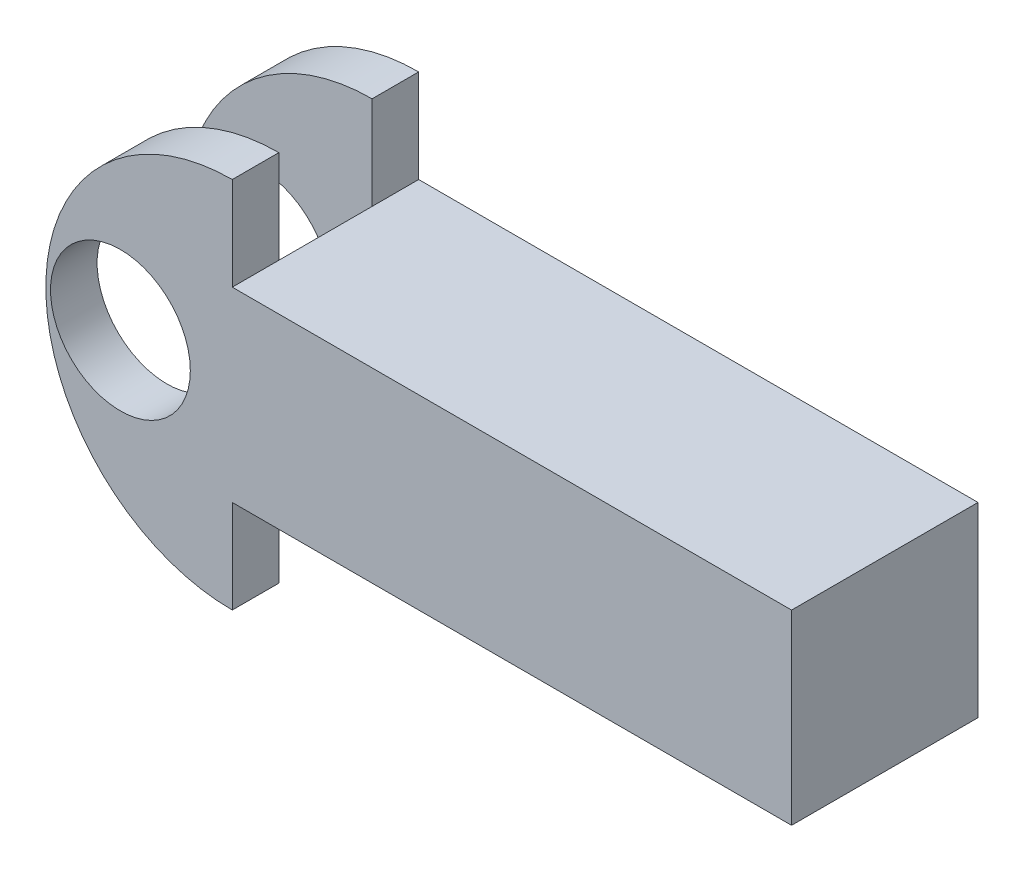
ISO-10303-21;
HEADER;
FILE_DESCRIPTION(('STEP AP214'),'2;1');
FILE_NAME('part.step','',(''),(''),'','','');
FILE_SCHEMA(('AUTOMOTIVE_DESIGN { 1 0 10303 214 1 1 1 1 }'));
ENDSEC;
DATA;
#1=APPLICATION_CONTEXT('core data for automotive mechanical design processes');
#2=APPLICATION_PROTOCOL_DEFINITION('international standard','automotive_design',2000,#1);
#3=PRODUCT_CONTEXT('',#1,'mechanical');
#4=PRODUCT('Part','Part','',(#3));
#5=PRODUCT_RELATED_PRODUCT_CATEGORY('part','',(#4));
#6=PRODUCT_DEFINITION_FORMATION('','',#4);
#7=PRODUCT_DEFINITION_CONTEXT('part definition',#1,'design');
#8=PRODUCT_DEFINITION('design','',#6,#7);
#9=PRODUCT_DEFINITION_SHAPE('','',#8);
#10=(LENGTH_UNIT() NAMED_UNIT(*) SI_UNIT(.MILLI.,.METRE.));
#11=(NAMED_UNIT(*) PLANE_ANGLE_UNIT() SI_UNIT($,.RADIAN.));
#12=(NAMED_UNIT(*) SI_UNIT($,.STERADIAN.) SOLID_ANGLE_UNIT());
#13=UNCERTAINTY_MEASURE_WITH_UNIT(LENGTH_MEASURE(1.E-05),#10,'distance_accuracy_value','');
#14=(GEOMETRIC_REPRESENTATION_CONTEXT(3) GLOBAL_UNCERTAINTY_ASSIGNED_CONTEXT((#13)) GLOBAL_UNIT_ASSIGNED_CONTEXT((#10,
#11,#12)) REPRESENTATION_CONTEXT('',''));
#15=CARTESIAN_POINT('',(0.,0.,0.));
#16=DIRECTION('',(0.,0.,1.));
#17=DIRECTION('',(1.,0.,0.));
#18=AXIS2_PLACEMENT_3D('',#15,#16,#17);
#19=CARTESIAN_POINT('',(30.,-10.,10.));
#20=DIRECTION('',(-1.,0.,0.));
#21=DIRECTION('',(0.,0.,1.));
#22=AXIS2_PLACEMENT_3D('',#19,#20,#21);
#23=PLANE('',#22);
#24=DIRECTION('',(0.,1.,0.));
#25=VECTOR('',#24,1.);
#26=CARTESIAN_POINT('',(30.,-10.,-10.));
#27=LINE('',#26,#25);
#28=CARTESIAN_POINT('',(30.,-10.,-10.));
#29=VERTEX_POINT('',#28);
#30=CARTESIAN_POINT('',(30.,10.,-10.));
#31=VERTEX_POINT('',#30);
#32=EDGE_CURVE('E187',#29,#31,#27,.T.);
#33=ORIENTED_EDGE('',*,*,#32,.T.);
#34=DIRECTION('',(0.,0.,-1.));
#35=VECTOR('',#34,1.);
#36=CARTESIAN_POINT('',(30.,10.,10.));
#37=LINE('',#36,#35);
#38=CARTESIAN_POINT('',(30.,10.,10.));
#39=VERTEX_POINT('',#38);
#40=EDGE_CURVE('E11',#39,#31,#37,.T.);
#41=ORIENTED_EDGE('',*,*,#40,.F.);
#42=DIRECTION('',(0.,1.,0.));
#43=VECTOR('',#42,1.);
#44=CARTESIAN_POINT('',(30.,-10.,10.));
#45=LINE('',#44,#43);
#46=CARTESIAN_POINT('',(30.,-10.,10.));
#47=VERTEX_POINT('',#46);
#48=EDGE_CURVE('E188',#47,#39,#45,.T.);
#49=ORIENTED_EDGE('',*,*,#48,.F.);
#50=DIRECTION('',(0.,0.,-1.));
#51=VECTOR('',#50,1.);
#52=CARTESIAN_POINT('',(30.,-10.,10.));
#53=LINE('',#52,#51);
#54=EDGE_CURVE('E194',#47,#29,#53,.T.);
#55=ORIENTED_EDGE('',*,*,#54,.T.);
#56=EDGE_LOOP('',(#33,#41,#49,#55));
#57=FACE_BOUND('',#56,.T.);
#58=ADVANCED_FACE('F40',(#57),#23,.F.);
#59=CARTESIAN_POINT('',(-30.,10.,10.));
#60=DIRECTION('',(0.,-1.,0.));
#61=DIRECTION('',(0.,0.,-1.));
#62=AXIS2_PLACEMENT_3D('',#59,#60,#61);
#63=PLANE('',#62);
#64=DIRECTION('',(-1.,0.,0.));
#65=VECTOR('',#64,1.);
#66=CARTESIAN_POINT('',(-30.,10.,-10.));
#67=LINE('',#66,#65);
#68=CARTESIAN_POINT('',(-30.,10.,-10.));
#69=VERTEX_POINT('',#68);
#70=EDGE_CURVE('E197',#31,#69,#67,.T.);
#71=ORIENTED_EDGE('',*,*,#70,.T.);
#72=DIRECTION('',(0.,0.,1.));
#73=VECTOR('',#72,1.);
#74=CARTESIAN_POINT('',(-30.,10.,10.));
#75=LINE('',#74,#73);
#76=CARTESIAN_POINT('',(-30.,10.,-5.));
#77=VERTEX_POINT('',#76);
#78=EDGE_CURVE('E185',#69,#77,#75,.T.);
#79=ORIENTED_EDGE('',*,*,#78,.T.);
#80=DIRECTION('',(0.,0.,-1.));
#81=VECTOR('',#80,1.);
#82=CARTESIAN_POINT('',(-30.,10.,10.));
#83=LINE('',#82,#81);
#84=CARTESIAN_POINT('',(-30.,9.99999999999999,5.));
#85=VERTEX_POINT('',#84);
#86=EDGE_CURVE('E54',#85,#77,#83,.T.);
#87=ORIENTED_EDGE('',*,*,#86,.F.);
#88=CARTESIAN_POINT('',(-30.,10.,10.));
#89=VERTEX_POINT('',#88);
#90=EDGE_CURVE('E47',#89,#85,#83,.T.);
#91=ORIENTED_EDGE('',*,*,#90,.F.);
#92=DIRECTION('',(-1.,0.,0.));
#93=VECTOR('',#92,1.);
#94=CARTESIAN_POINT('',(-30.,10.,10.));
#95=LINE('',#94,#93);
#96=EDGE_CURVE('E127',#39,#89,#95,.T.);
#97=ORIENTED_EDGE('',*,*,#96,.F.);
#98=ORIENTED_EDGE('',*,*,#40,.T.);
#99=EDGE_LOOP('',(#71,#79,#87,#91,#97,#98));
#100=FACE_BOUND('',#99,.T.);
#101=ADVANCED_FACE('F208',(#100),#63,.F.);
#102=CARTESIAN_POINT('',(-30.,-10.,10.));
#103=DIRECTION('',(1.,0.,0.));
#104=DIRECTION('',(0.,0.,-1.));
#105=AXIS2_PLACEMENT_3D('',#102,#103,#104);
#106=PLANE('',#105);
#107=DIRECTION('',(0.,0.,-1.));
#108=VECTOR('',#107,1.);
#109=CARTESIAN_POINT('',(-30.,-10.,10.));
#110=LINE('',#109,#108);
#111=CARTESIAN_POINT('',(-30.,-10.,5.));
#112=VERTEX_POINT('',#111);
#113=CARTESIAN_POINT('',(-30.,-10.,-5.));
#114=VERTEX_POINT('',#113);
#115=EDGE_CURVE('E62',#112,#114,#110,.T.);
#116=ORIENTED_EDGE('',*,*,#115,.F.);
#117=DIRECTION('',(0.,1.,0.));
#118=VECTOR('',#117,1.);
#119=CARTESIAN_POINT('',(-30.,20.,5.));
#120=LINE('',#119,#118);
#121=EDGE_CURVE('E147',#112,#85,#120,.T.);
#122=ORIENTED_EDGE('',*,*,#121,.T.);
#123=ORIENTED_EDGE('',*,*,#86,.T.);
#124=DIRECTION('',(0.,1.,0.));
#125=VECTOR('',#124,1.);
#126=CARTESIAN_POINT('',(-30.,20.,-5.));
#127=LINE('',#126,#125);
#128=EDGE_CURVE('E178',#114,#77,#127,.T.);
#129=ORIENTED_EDGE('',*,*,#128,.F.);
#130=EDGE_LOOP('',(#116,#122,#123,#129));
#131=FACE_BOUND('',#130,.T.);
#132=ADVANCED_FACE('F207',(#131),#106,.F.);
#133=CARTESIAN_POINT('',(-30.,-10.,10.));
#134=DIRECTION('',(0.,1.,0.));
#135=DIRECTION('',(0.,0.,1.));
#136=AXIS2_PLACEMENT_3D('',#133,#134,#135);
#137=PLANE('',#136);
#138=DIRECTION('',(1.,0.,0.));
#139=VECTOR('',#138,1.);
#140=CARTESIAN_POINT('',(-30.,-10.,-10.));
#141=LINE('',#140,#139);
#142=CARTESIAN_POINT('',(-30.,-10.,-10.));
#143=VERTEX_POINT('',#142);
#144=EDGE_CURVE('E190',#143,#29,#141,.T.);
#145=ORIENTED_EDGE('',*,*,#144,.T.);
#146=ORIENTED_EDGE('',*,*,#54,.F.);
#147=DIRECTION('',(1.,0.,0.));
#148=VECTOR('',#147,1.);
#149=CARTESIAN_POINT('',(-30.,-10.,10.));
#150=LINE('',#149,#148);
#151=CARTESIAN_POINT('',(-30.,-10.,10.));
#152=VERTEX_POINT('',#151);
#153=EDGE_CURVE('E192',#152,#47,#150,.T.);
#154=ORIENTED_EDGE('',*,*,#153,.F.);
#155=EDGE_CURVE('E202',#152,#112,#110,.T.);
#156=ORIENTED_EDGE('',*,*,#155,.T.);
#157=ORIENTED_EDGE('',*,*,#115,.T.);
#158=DIRECTION('',(0.,0.,-1.));
#159=VECTOR('',#158,1.);
#160=CARTESIAN_POINT('',(-30.,-10.,10.));
#161=LINE('',#160,#159);
#162=EDGE_CURVE('E182',#114,#143,#161,.T.);
#163=ORIENTED_EDGE('',*,*,#162,.T.);
#164=EDGE_LOOP('',(#145,#146,#154,#156,#157,#163));
#165=FACE_BOUND('',#164,.T.);
#166=ADVANCED_FACE('F224',(#165),#137,.F.);
#167=CARTESIAN_POINT('',(0.,0.,10.));
#168=DIRECTION('',(0.,0.,-1.));
#169=DIRECTION('',(-1.,0.,0.));
#170=AXIS2_PLACEMENT_3D('',#167,#168,#169);
#171=PLANE('',#170);
#172=ORIENTED_EDGE('',*,*,#48,.T.);
#173=ORIENTED_EDGE('',*,*,#96,.T.);
#174=DIRECTION('',(0.,1.,0.));
#175=VECTOR('',#174,1.);
#176=CARTESIAN_POINT('',(-30.,20.,10.));
#177=LINE('',#176,#175);
#178=CARTESIAN_POINT('',(-30.,20.,10.));
#179=VERTEX_POINT('',#178);
#180=EDGE_CURVE('E119',#89,#179,#177,.T.);
#181=ORIENTED_EDGE('',*,*,#180,.T.);
#182=CARTESIAN_POINT('',(-30.,0.,10.));
#183=DIRECTION('',(0.,0.,1.));
#184=DIRECTION('',(1.,0.,0.));
#185=AXIS2_PLACEMENT_3D('',#182,#183,#184);
#186=CIRCLE('',#185,20.);
#187=CARTESIAN_POINT('',(-30.,-20.,10.));
#188=VERTEX_POINT('',#187);
#189=EDGE_CURVE('E125',#179,#188,#186,.T.);
#190=ORIENTED_EDGE('',*,*,#189,.T.);
#191=EDGE_CURVE('E130',#188,#152,#177,.T.);
#192=ORIENTED_EDGE('',*,*,#191,.T.);
#193=ORIENTED_EDGE('',*,*,#153,.T.);
#194=EDGE_LOOP('',(#172,#173,#181,#190,#192,#193));
#195=FACE_BOUND('',#194,.T.);
#196=CARTESIAN_POINT('',(-42.,0.,10.));
#197=DIRECTION('',(0.,0.,1.));
#198=DIRECTION('',(1.,0.,0.));
#199=AXIS2_PLACEMENT_3D('',#196,#197,#198);
#200=CIRCLE('',#199,7.5);
#201=CARTESIAN_POINT('',(-34.5,0.,10.));
#202=VERTEX_POINT('',#201);
#203=EDGE_CURVE('E154',#202,#202,#200,.T.);
#204=ORIENTED_EDGE('',*,*,#203,.F.);
#205=EDGE_LOOP('',(#204));
#206=FACE_BOUND('',#205,.T.);
#207=ADVANCED_FACE('F122',(#195,#206),#171,.F.);
#208=CARTESIAN_POINT('',(0.,0.,-10.));
#209=DIRECTION('',(0.,0.,-1.));
#210=DIRECTION('',(-1.,0.,0.));
#211=AXIS2_PLACEMENT_3D('',#208,#209,#210);
#212=PLANE('',#211);
#213=ORIENTED_EDGE('',*,*,#32,.F.);
#214=ORIENTED_EDGE('',*,*,#144,.F.);
#215=DIRECTION('',(0.,1.,0.));
#216=VECTOR('',#215,1.);
#217=CARTESIAN_POINT('',(-30.,20.,-10.));
#218=LINE('',#217,#216);
#219=CARTESIAN_POINT('',(-30.,-20.,-10.));
#220=VERTEX_POINT('',#219);
#221=EDGE_CURVE('E169',#220,#143,#218,.T.);
#222=ORIENTED_EDGE('',*,*,#221,.F.);
#223=CARTESIAN_POINT('',(-30.,0.,-10.));
#224=DIRECTION('',(0.,0.,1.));
#225=DIRECTION('',(1.,0.,0.));
#226=AXIS2_PLACEMENT_3D('',#223,#224,#225);
#227=CIRCLE('',#226,20.);
#228=CARTESIAN_POINT('',(-30.,20.,-10.));
#229=VERTEX_POINT('',#228);
#230=EDGE_CURVE('E164',#229,#220,#227,.T.);
#231=ORIENTED_EDGE('',*,*,#230,.F.);
#232=EDGE_CURVE('E167',#69,#229,#218,.T.);
#233=ORIENTED_EDGE('',*,*,#232,.F.);
#234=ORIENTED_EDGE('',*,*,#70,.F.);
#235=EDGE_LOOP('',(#213,#214,#222,#231,#233,#234));
#236=FACE_BOUND('',#235,.T.);
#237=CARTESIAN_POINT('',(-42.,0.,-10.));
#238=DIRECTION('',(0.,0.,1.));
#239=DIRECTION('',(1.,0.,0.));
#240=AXIS2_PLACEMENT_3D('',#237,#238,#239);
#241=CIRCLE('',#240,7.5);
#242=CARTESIAN_POINT('',(-34.5,0.,-10.));
#243=VERTEX_POINT('',#242);
#244=EDGE_CURVE('E158',#243,#243,#241,.T.);
#245=ORIENTED_EDGE('',*,*,#244,.T.);
#246=EDGE_LOOP('',(#245));
#247=FACE_BOUND('',#246,.T.);
#248=ADVANCED_FACE('F232',(#236,#247),#212,.T.);
#249=CARTESIAN_POINT('',(-30.,20.,-10.));
#250=DIRECTION('',(1.,0.,0.));
#251=DIRECTION('',(0.,0.,-1.));
#252=AXIS2_PLACEMENT_3D('',#249,#250,#251);
#253=PLANE('',#252);
#254=ORIENTED_EDGE('',*,*,#78,.F.);
#255=ORIENTED_EDGE('',*,*,#232,.T.);
#256=DIRECTION('',(0.,0.,1.));
#257=VECTOR('',#256,1.);
#258=CARTESIAN_POINT('',(-30.,20.,-10.));
#259=LINE('',#258,#257);
#260=CARTESIAN_POINT('',(-30.,20.,-5.));
#261=VERTEX_POINT('',#260);
#262=EDGE_CURVE('E179',#229,#261,#259,.T.);
#263=ORIENTED_EDGE('',*,*,#262,.T.);
#264=EDGE_CURVE('E175',#77,#261,#127,.T.);
#265=ORIENTED_EDGE('',*,*,#264,.F.);
#266=EDGE_LOOP('',(#254,#255,#263,#265));
#267=FACE_BOUND('',#266,.T.);
#268=ADVANCED_FACE('F214',(#267),#253,.T.);
#269=ORIENTED_EDGE('',*,*,#162,.F.);
#270=CARTESIAN_POINT('',(-30.,-20.,-5.));
#271=VERTEX_POINT('',#270);
#272=EDGE_CURVE('E168',#271,#114,#127,.T.);
#273=ORIENTED_EDGE('',*,*,#272,.F.);
#274=DIRECTION('',(0.,0.,1.));
#275=VECTOR('',#274,1.);
#276=CARTESIAN_POINT('',(-30.,-20.,-10.));
#277=LINE('',#276,#275);
#278=EDGE_CURVE('E172',#220,#271,#277,.T.);
#279=ORIENTED_EDGE('',*,*,#278,.F.);
#280=ORIENTED_EDGE('',*,*,#221,.T.);
#281=EDGE_LOOP('',(#269,#273,#279,#280));
#282=FACE_BOUND('',#281,.T.);
#283=ADVANCED_FACE('F222',(#282),#253,.T.);
#284=CARTESIAN_POINT('',(-30.,0.,-10.));
#285=DIRECTION('',(0.,0.,1.));
#286=DIRECTION('',(1.,0.,0.));
#287=AXIS2_PLACEMENT_3D('',#284,#285,#286);
#288=CYLINDRICAL_SURFACE('',#287,20.);
#289=CARTESIAN_POINT('',(-30.,0.,-5.));
#290=DIRECTION('',(0.,0.,1.));
#291=DIRECTION('',(1.,0.,0.));
#292=AXIS2_PLACEMENT_3D('',#289,#290,#291);
#293=CIRCLE('',#292,20.);
#294=EDGE_CURVE('E161',#261,#271,#293,.T.);
#295=ORIENTED_EDGE('',*,*,#294,.F.);
#296=ORIENTED_EDGE('',*,*,#262,.F.);
#297=ORIENTED_EDGE('',*,*,#230,.T.);
#298=ORIENTED_EDGE('',*,*,#278,.T.);
#299=EDGE_LOOP('',(#295,#296,#297,#298));
#300=FACE_BOUND('',#299,.T.);
#301=ADVANCED_FACE('F262',(#300),#288,.T.);
#302=CARTESIAN_POINT('',(-30.,0.,-5.));
#303=DIRECTION('',(0.,0.,1.));
#304=DIRECTION('',(1.,0.,0.));
#305=AXIS2_PLACEMENT_3D('',#302,#303,#304);
#306=PLANE('',#305);
#307=CARTESIAN_POINT('',(-42.,0.,-5.));
#308=DIRECTION('',(0.,0.,1.));
#309=DIRECTION('',(1.,0.,0.));
#310=AXIS2_PLACEMENT_3D('',#307,#308,#309);
#311=CIRCLE('',#310,7.5);
#312=CARTESIAN_POINT('',(-34.5,0.,-5.));
#313=VERTEX_POINT('',#312);
#314=EDGE_CURVE('E156',#313,#313,#311,.T.);
#315=ORIENTED_EDGE('',*,*,#314,.F.);
#316=EDGE_LOOP('',(#315));
#317=FACE_BOUND('',#316,.T.);
#318=ORIENTED_EDGE('',*,*,#294,.T.);
#319=ORIENTED_EDGE('',*,*,#272,.T.);
#320=ORIENTED_EDGE('',*,*,#128,.T.);
#321=ORIENTED_EDGE('',*,*,#264,.T.);
#322=EDGE_LOOP('',(#318,#319,#320,#321));
#323=FACE_BOUND('',#322,.T.);
#324=ADVANCED_FACE('F218',(#317,#323),#306,.T.);
#325=CARTESIAN_POINT('',(-42.,0.,-10.));
#326=DIRECTION('',(0.,0.,1.));
#327=DIRECTION('',(1.,0.,0.));
#328=AXIS2_PLACEMENT_3D('',#325,#326,#327);
#329=CYLINDRICAL_SURFACE('',#328,7.5);
#330=ORIENTED_EDGE('',*,*,#244,.F.);
#331=EDGE_LOOP('',(#330));
#332=FACE_BOUND('',#331,.T.);
#333=ORIENTED_EDGE('',*,*,#314,.T.);
#334=EDGE_LOOP('',(#333));
#335=FACE_BOUND('',#334,.T.);
#336=ADVANCED_FACE('F245',(#332,#335),#329,.F.);
#337=CARTESIAN_POINT('',(-30.,20.,10.));
#338=DIRECTION('',(-1.,0.,0.));
#339=DIRECTION('',(0.,0.,1.));
#340=AXIS2_PLACEMENT_3D('',#337,#338,#339);
#341=PLANE('',#340);
#342=ORIENTED_EDGE('',*,*,#180,.F.);
#343=ORIENTED_EDGE('',*,*,#90,.T.);
#344=CARTESIAN_POINT('',(-30.,20.,5.));
#345=VERTEX_POINT('',#344);
#346=EDGE_CURVE('E136',#85,#345,#120,.T.);
#347=ORIENTED_EDGE('',*,*,#346,.T.);
#348=DIRECTION('',(0.,0.,-1.));
#349=VECTOR('',#348,1.);
#350=CARTESIAN_POINT('',(-30.,20.,10.));
#351=LINE('',#350,#349);
#352=EDGE_CURVE('E133',#179,#345,#351,.T.);
#353=ORIENTED_EDGE('',*,*,#352,.F.);
#354=EDGE_LOOP('',(#342,#343,#347,#353));
#355=FACE_BOUND('',#354,.T.);
#356=ADVANCED_FACE('F134',(#355),#341,.F.);
#357=CARTESIAN_POINT('',(-30.,-20.,5.));
#358=VERTEX_POINT('',#357);
#359=EDGE_CURVE('E144',#358,#112,#120,.T.);
#360=ORIENTED_EDGE('',*,*,#359,.T.);
#361=ORIENTED_EDGE('',*,*,#155,.F.);
#362=ORIENTED_EDGE('',*,*,#191,.F.);
#363=DIRECTION('',(0.,0.,-1.));
#364=VECTOR('',#363,1.);
#365=CARTESIAN_POINT('',(-30.,-20.,10.));
#366=LINE('',#365,#364);
#367=EDGE_CURVE('E140',#188,#358,#366,.T.);
#368=ORIENTED_EDGE('',*,*,#367,.T.);
#369=EDGE_LOOP('',(#360,#361,#362,#368));
#370=FACE_BOUND('',#369,.T.);
#371=ADVANCED_FACE('F237',(#370),#341,.F.);
#372=CARTESIAN_POINT('',(-30.,0.,5.));
#373=DIRECTION('',(0.,0.,-1.));
#374=DIRECTION('',(1.,0.,0.));
#375=AXIS2_PLACEMENT_3D('',#372,#373,#374);
#376=PLANE('',#375);
#377=CARTESIAN_POINT('',(-30.,0.,5.));
#378=DIRECTION('',(0.,0.,1.));
#379=DIRECTION('',(1.,0.,0.));
#380=AXIS2_PLACEMENT_3D('',#377,#378,#379);
#381=CIRCLE('',#380,20.);
#382=EDGE_CURVE('E153',#345,#358,#381,.T.);
#383=ORIENTED_EDGE('',*,*,#382,.F.);
#384=ORIENTED_EDGE('',*,*,#346,.F.);
#385=ORIENTED_EDGE('',*,*,#121,.F.);
#386=ORIENTED_EDGE('',*,*,#359,.F.);
#387=EDGE_LOOP('',(#383,#384,#385,#386));
#388=FACE_BOUND('',#387,.T.);
#389=CARTESIAN_POINT('',(-42.,0.,5.));
#390=DIRECTION('',(0.,0.,1.));
#391=DIRECTION('',(1.,0.,0.));
#392=AXIS2_PLACEMENT_3D('',#389,#390,#391);
#393=CIRCLE('',#392,7.5);
#394=CARTESIAN_POINT('',(-34.5,0.,5.));
#395=VERTEX_POINT('',#394);
#396=EDGE_CURVE('E150',#395,#395,#393,.T.);
#397=ORIENTED_EDGE('',*,*,#396,.T.);
#398=EDGE_LOOP('',(#397));
#399=FACE_BOUND('',#398,.T.);
#400=ADVANCED_FACE('F205',(#388,#399),#376,.T.);
#401=CARTESIAN_POINT('',(-30.,0.,10.));
#402=DIRECTION('',(0.,0.,-1.));
#403=DIRECTION('',(-1.,0.,0.));
#404=AXIS2_PLACEMENT_3D('',#401,#402,#403);
#405=CYLINDRICAL_SURFACE('',#404,20.);
#406=ORIENTED_EDGE('',*,*,#382,.T.);
#407=ORIENTED_EDGE('',*,*,#367,.F.);
#408=ORIENTED_EDGE('',*,*,#189,.F.);
#409=ORIENTED_EDGE('',*,*,#352,.T.);
#410=EDGE_LOOP('',(#406,#407,#408,#409));
#411=FACE_BOUND('',#410,.T.);
#412=ADVANCED_FACE('F142',(#411),#405,.T.);
#413=CARTESIAN_POINT('',(-42.,0.,10.));
#414=DIRECTION('',(0.,0.,-1.));
#415=DIRECTION('',(-1.,0.,0.));
#416=AXIS2_PLACEMENT_3D('',#413,#414,#415);
#417=CYLINDRICAL_SURFACE('',#416,7.5);
#418=ORIENTED_EDGE('',*,*,#203,.T.);
#419=EDGE_LOOP('',(#418));
#420=FACE_BOUND('',#419,.T.);
#421=ORIENTED_EDGE('',*,*,#396,.F.);
#422=EDGE_LOOP('',(#421));
#423=FACE_BOUND('',#422,.T.);
#424=ADVANCED_FACE('F274',(#420,#423),#417,.F.);
#425=CLOSED_SHELL('',(#58,#101,#132,#166,#207,#248,#268,#283,#301,#324,#336,#356,#371,#400,#412,#424));
#426=MANIFOLD_SOLID_BREP('B2',#425);
#427=ADVANCED_BREP_SHAPE_REPRESENTATION('',(#18,#426),#14);
#428=SHAPE_DEFINITION_REPRESENTATION(#9,#427);
ENDSEC;
END-ISO-10303-21;
